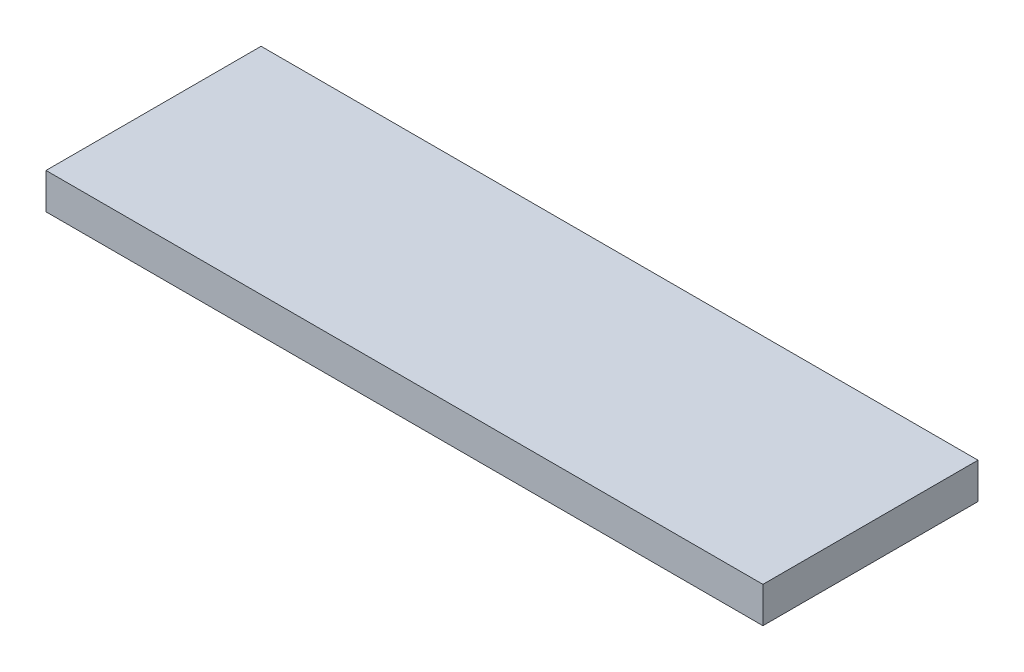
ISO-10303-21;
HEADER;
FILE_DESCRIPTION(('STEP AP214'),'2;1');
FILE_NAME('part.step','',(''),(''),'','','');
FILE_SCHEMA(('AUTOMOTIVE_DESIGN { 1 0 10303 214 1 1 1 1 }'));
ENDSEC;
DATA;
#1=APPLICATION_CONTEXT('core data for automotive mechanical design processes');
#2=APPLICATION_PROTOCOL_DEFINITION('international standard','automotive_design',2000,#1);
#3=PRODUCT_CONTEXT('',#1,'mechanical');
#4=PRODUCT('Part','Part','',(#3));
#5=PRODUCT_RELATED_PRODUCT_CATEGORY('part','',(#4));
#6=PRODUCT_DEFINITION_FORMATION('','',#4);
#7=PRODUCT_DEFINITION_CONTEXT('part definition',#1,'design');
#8=PRODUCT_DEFINITION('design','',#6,#7);
#9=PRODUCT_DEFINITION_SHAPE('','',#8);
#10=(LENGTH_UNIT() NAMED_UNIT(*) SI_UNIT(.MILLI.,.METRE.));
#11=(NAMED_UNIT(*) PLANE_ANGLE_UNIT() SI_UNIT($,.RADIAN.));
#12=(NAMED_UNIT(*) SI_UNIT($,.STERADIAN.) SOLID_ANGLE_UNIT());
#13=UNCERTAINTY_MEASURE_WITH_UNIT(LENGTH_MEASURE(1.E-05),#10,'distance_accuracy_value','');
#14=(GEOMETRIC_REPRESENTATION_CONTEXT(3) GLOBAL_UNCERTAINTY_ASSIGNED_CONTEXT((#13)) GLOBAL_UNIT_ASSIGNED_CONTEXT((#10,
#11,#12)) REPRESENTATION_CONTEXT('',''));
#15=CARTESIAN_POINT('',(0.,0.,0.));
#16=DIRECTION('',(0.,0.,1.));
#17=DIRECTION('',(1.,0.,0.));
#18=AXIS2_PLACEMENT_3D('',#15,#16,#17);
#19=CARTESIAN_POINT('',(-63.5,6.35,19.05));
#20=DIRECTION('',(1.,0.,0.));
#21=DIRECTION('',(0.,0.,-1.));
#22=AXIS2_PLACEMENT_3D('',#19,#20,#21);
#23=PLANE('',#22);
#24=DIRECTION('',(0.,0.,1.));
#25=VECTOR('',#24,1.);
#26=CARTESIAN_POINT('',(-63.5,0.,19.05));
#27=LINE('',#26,#25);
#28=CARTESIAN_POINT('',(-63.5,0.,-19.05));
#29=VERTEX_POINT('',#28);
#30=CARTESIAN_POINT('',(-63.5,0.,19.05));
#31=VERTEX_POINT('',#30);
#32=EDGE_CURVE('E95',#29,#31,#27,.T.);
#33=ORIENTED_EDGE('',*,*,#32,.T.);
#34=DIRECTION('',(0.,-1.,0.));
#35=VECTOR('',#34,1.);
#36=CARTESIAN_POINT('',(-63.5,6.35,19.05));
#37=LINE('',#36,#35);
#38=CARTESIAN_POINT('',(-63.5,6.35,19.05));
#39=VERTEX_POINT('',#38);
#40=EDGE_CURVE('E11',#39,#31,#37,.T.);
#41=ORIENTED_EDGE('',*,*,#40,.F.);
#42=DIRECTION('',(0.,0.,1.));
#43=VECTOR('',#42,1.);
#44=CARTESIAN_POINT('',(-63.5,6.35,19.05));
#45=LINE('',#44,#43);
#46=CARTESIAN_POINT('',(-63.5,6.35,-19.05));
#47=VERTEX_POINT('',#46);
#48=EDGE_CURVE('E83',#47,#39,#45,.T.);
#49=ORIENTED_EDGE('',*,*,#48,.F.);
#50=DIRECTION('',(0.,-1.,0.));
#51=VECTOR('',#50,1.);
#52=CARTESIAN_POINT('',(-63.5,6.35,-19.05));
#53=LINE('',#52,#51);
#54=EDGE_CURVE('E91',#47,#29,#53,.T.);
#55=ORIENTED_EDGE('',*,*,#54,.T.);
#56=EDGE_LOOP('',(#33,#41,#49,#55));
#57=FACE_BOUND('',#56,.T.);
#58=ADVANCED_FACE('F32',(#57),#23,.F.);
#59=CARTESIAN_POINT('',(63.5,6.35,19.05));
#60=DIRECTION('',(0.,0.,-1.));
#61=DIRECTION('',(-1.,0.,0.));
#62=AXIS2_PLACEMENT_3D('',#59,#60,#61);
#63=PLANE('',#62);
#64=DIRECTION('',(1.,0.,0.));
#65=VECTOR('',#64,1.);
#66=CARTESIAN_POINT('',(63.5,0.,19.05));
#67=LINE('',#66,#65);
#68=CARTESIAN_POINT('',(63.5,0.,19.05));
#69=VERTEX_POINT('',#68);
#70=EDGE_CURVE('E87',#31,#69,#67,.T.);
#71=ORIENTED_EDGE('',*,*,#70,.T.);
#72=DIRECTION('',(0.,-1.,0.));
#73=VECTOR('',#72,1.);
#74=CARTESIAN_POINT('',(63.5,6.35,19.05));
#75=LINE('',#74,#73);
#76=CARTESIAN_POINT('',(63.5,6.35,19.05));
#77=VERTEX_POINT('',#76);
#78=EDGE_CURVE('E40',#77,#69,#75,.T.);
#79=ORIENTED_EDGE('',*,*,#78,.F.);
#80=DIRECTION('',(1.,0.,0.));
#81=VECTOR('',#80,1.);
#82=CARTESIAN_POINT('',(63.5,6.35,19.05));
#83=LINE('',#82,#81);
#84=EDGE_CURVE('E78',#39,#77,#83,.T.);
#85=ORIENTED_EDGE('',*,*,#84,.F.);
#86=ORIENTED_EDGE('',*,*,#40,.T.);
#87=EDGE_LOOP('',(#71,#79,#85,#86));
#88=FACE_BOUND('',#87,.T.);
#89=ADVANCED_FACE('F86',(#88),#63,.F.);
#90=CARTESIAN_POINT('',(63.5,6.35,19.05));
#91=DIRECTION('',(-1.,0.,0.));
#92=DIRECTION('',(0.,0.,1.));
#93=AXIS2_PLACEMENT_3D('',#90,#91,#92);
#94=PLANE('',#93);
#95=DIRECTION('',(0.,0.,-1.));
#96=VECTOR('',#95,1.);
#97=CARTESIAN_POINT('',(63.5,0.,19.05));
#98=LINE('',#97,#96);
#99=CARTESIAN_POINT('',(63.5,0.,-19.05));
#100=VERTEX_POINT('',#99);
#101=EDGE_CURVE('E65',#69,#100,#98,.T.);
#102=ORIENTED_EDGE('',*,*,#101,.T.);
#103=DIRECTION('',(0.,-1.,0.));
#104=VECTOR('',#103,1.);
#105=CARTESIAN_POINT('',(63.5,6.35,-19.05));
#106=LINE('',#105,#104);
#107=CARTESIAN_POINT('',(63.5,6.35,-19.05));
#108=VERTEX_POINT('',#107);
#109=EDGE_CURVE('E88',#108,#100,#106,.T.);
#110=ORIENTED_EDGE('',*,*,#109,.F.);
#111=DIRECTION('',(0.,0.,-1.));
#112=VECTOR('',#111,1.);
#113=CARTESIAN_POINT('',(63.5,6.35,19.05));
#114=LINE('',#113,#112);
#115=EDGE_CURVE('E81',#77,#108,#114,.T.);
#116=ORIENTED_EDGE('',*,*,#115,.F.);
#117=ORIENTED_EDGE('',*,*,#78,.T.);
#118=EDGE_LOOP('',(#102,#110,#116,#117));
#119=FACE_BOUND('',#118,.T.);
#120=ADVANCED_FACE('F89',(#119),#94,.F.);
#121=CARTESIAN_POINT('',(63.5,6.35,-19.05));
#122=DIRECTION('',(0.,0.,1.));
#123=DIRECTION('',(1.,0.,0.));
#124=AXIS2_PLACEMENT_3D('',#121,#122,#123);
#125=PLANE('',#124);
#126=DIRECTION('',(-1.,0.,0.));
#127=VECTOR('',#126,1.);
#128=CARTESIAN_POINT('',(63.5,0.,-19.05));
#129=LINE('',#128,#127);
#130=EDGE_CURVE('E71',#100,#29,#129,.T.);
#131=ORIENTED_EDGE('',*,*,#130,.T.);
#132=ORIENTED_EDGE('',*,*,#54,.F.);
#133=DIRECTION('',(-1.,0.,0.));
#134=VECTOR('',#133,1.);
#135=CARTESIAN_POINT('',(63.5,6.35,-19.05));
#136=LINE('',#135,#134);
#137=EDGE_CURVE('E48',#108,#47,#136,.T.);
#138=ORIENTED_EDGE('',*,*,#137,.F.);
#139=ORIENTED_EDGE('',*,*,#109,.T.);
#140=EDGE_LOOP('',(#131,#132,#138,#139));
#141=FACE_BOUND('',#140,.T.);
#142=ADVANCED_FACE('F102',(#141),#125,.F.);
#143=CARTESIAN_POINT('',(0.,6.35,0.));
#144=DIRECTION('',(0.,1.,0.));
#145=DIRECTION('',(0.,0.,1.));
#146=AXIS2_PLACEMENT_3D('',#143,#144,#145);
#147=PLANE('',#146);
#148=ORIENTED_EDGE('',*,*,#48,.T.);
#149=ORIENTED_EDGE('',*,*,#84,.T.);
#150=ORIENTED_EDGE('',*,*,#115,.T.);
#151=ORIENTED_EDGE('',*,*,#137,.T.);
#152=EDGE_LOOP('',(#148,#149,#150,#151));
#153=FACE_BOUND('',#152,.T.);
#154=ADVANCED_FACE('F79',(#153),#147,.T.);
#155=CARTESIAN_POINT('',(0.,0.,0.));
#156=DIRECTION('',(0.,1.,0.));
#157=DIRECTION('',(0.,0.,1.));
#158=AXIS2_PLACEMENT_3D('',#155,#156,#157);
#159=PLANE('',#158);
#160=ORIENTED_EDGE('',*,*,#32,.F.);
#161=ORIENTED_EDGE('',*,*,#130,.F.);
#162=ORIENTED_EDGE('',*,*,#101,.F.);
#163=ORIENTED_EDGE('',*,*,#70,.F.);
#164=EDGE_LOOP('',(#160,#161,#162,#163));
#165=FACE_BOUND('',#164,.T.);
#166=ADVANCED_FACE('F105',(#165),#159,.F.);
#167=CLOSED_SHELL('',(#58,#89,#120,#142,#154,#166));
#168=MANIFOLD_SOLID_BREP('B2',#167);
#169=ADVANCED_BREP_SHAPE_REPRESENTATION('',(#18,#168),#14);
#170=SHAPE_DEFINITION_REPRESENTATION(#9,#169);
ENDSEC;
END-ISO-10303-21;
